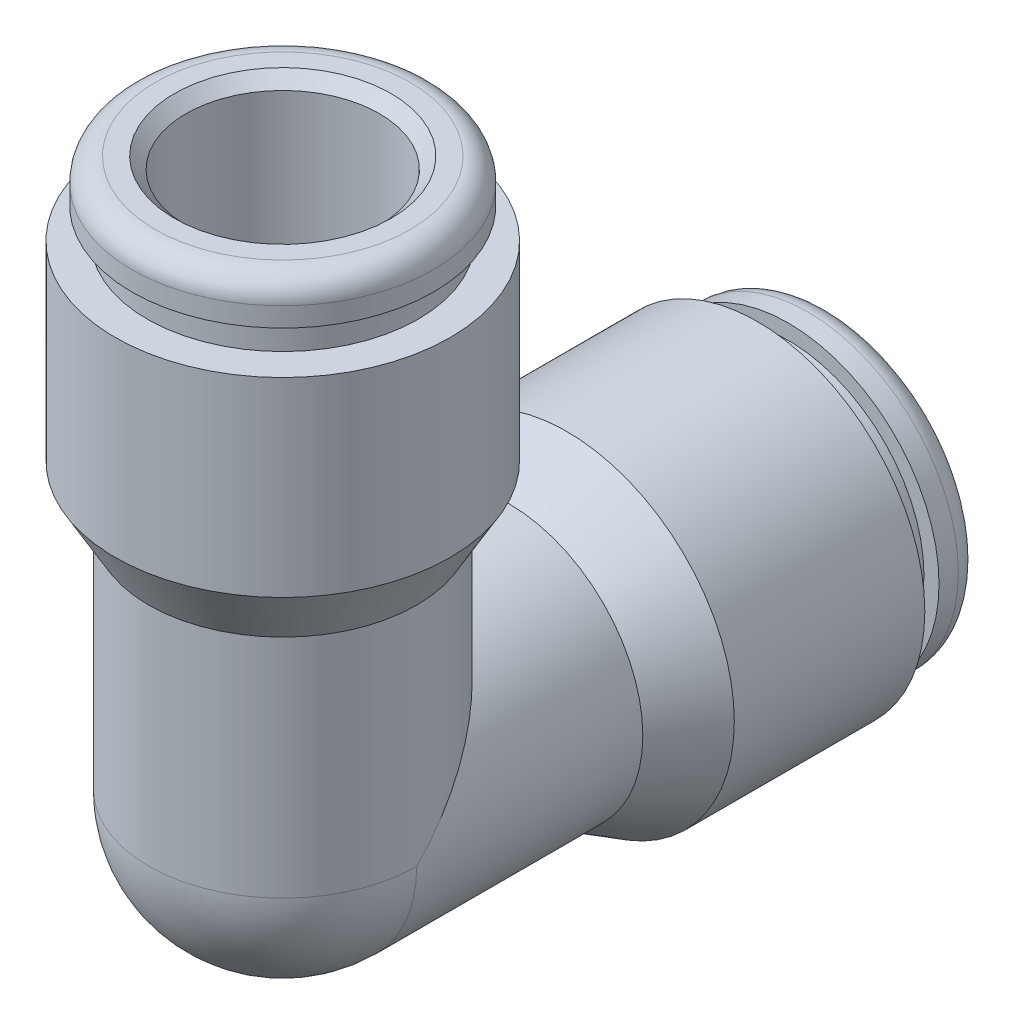
ISO-10303-21;
HEADER;
FILE_DESCRIPTION(('STEP AP214'),'2;1');
FILE_NAME('part.step','',(''),(''),'','','');
FILE_SCHEMA(('AUTOMOTIVE_DESIGN { 1 0 10303 214 1 1 1 1 }'));
ENDSEC;
DATA;
#1=APPLICATION_CONTEXT('core data for automotive mechanical design processes');
#2=APPLICATION_PROTOCOL_DEFINITION('international standard','automotive_design',2000,#1);
#3=PRODUCT_CONTEXT('',#1,'mechanical');
#4=PRODUCT('Part','Part','',(#3));
#5=PRODUCT_RELATED_PRODUCT_CATEGORY('part','',(#4));
#6=PRODUCT_DEFINITION_FORMATION('','',#4);
#7=PRODUCT_DEFINITION_CONTEXT('part definition',#1,'design');
#8=PRODUCT_DEFINITION('design','',#6,#7);
#9=PRODUCT_DEFINITION_SHAPE('','',#8);
#10=(LENGTH_UNIT() NAMED_UNIT(*) SI_UNIT(.MILLI.,.METRE.));
#11=(NAMED_UNIT(*) PLANE_ANGLE_UNIT() SI_UNIT($,.RADIAN.));
#12=(NAMED_UNIT(*) SI_UNIT($,.STERADIAN.) SOLID_ANGLE_UNIT());
#13=UNCERTAINTY_MEASURE_WITH_UNIT(LENGTH_MEASURE(1.E-05),#10,'distance_accuracy_value','');
#14=(GEOMETRIC_REPRESENTATION_CONTEXT(3) GLOBAL_UNCERTAINTY_ASSIGNED_CONTEXT((#13)) GLOBAL_UNIT_ASSIGNED_CONTEXT((#10,
#11,#12)) REPRESENTATION_CONTEXT('',''));
#15=CARTESIAN_POINT('',(0.,0.,0.));
#16=DIRECTION('',(0.,0.,1.));
#17=DIRECTION('',(1.,0.,0.));
#18=AXIS2_PLACEMENT_3D('',#15,#16,#17);
#19=CARTESIAN_POINT('',(0.,0.,0.));
#20=DIRECTION('',(0.,0.,1.));
#21=DIRECTION('',(1.,0.,0.));
#22=AXIS2_PLACEMENT_3D('',#19,#20,#21);
#23=CYLINDRICAL_SURFACE('',#22,2.413);
#24=CARTESIAN_POINT('',(0.,0.,-3.49914000000001));
#25=DIRECTION('',(0.,0.,1.));
#26=DIRECTION('',(1.,0.,0.));
#27=AXIS2_PLACEMENT_3D('',#24,#25,#26);
#28=CIRCLE('',#27,2.413);
#29=CARTESIAN_POINT('',(2.413,0.,-3.49914000000001));
#30=VERTEX_POINT('',#29);
#31=EDGE_CURVE('E11',#30,#30,#28,.T.);
#32=ORIENTED_EDGE('',*,*,#31,.F.);
#33=EDGE_LOOP('',(#32));
#34=FACE_BOUND('',#33,.T.);
#35=CARTESIAN_POINT('',(0.,0.,0.));
#36=DIRECTION('',(0.,0.707106781186546,0.707106781186549));
#37=DIRECTION('',(0.,-0.707106781186549,0.707106781186546));
#38=AXIS2_PLACEMENT_3D('',#35,#36,#37);
#39=ELLIPSE('',#38,3.41249732600627,2.413);
#40=CARTESIAN_POINT('',(-2.413,0.,0.));
#41=VERTEX_POINT('',#40);
#42=CARTESIAN_POINT('',(2.413,0.,0.));
#43=VERTEX_POINT('',#42);
#44=EDGE_CURVE('E67',#41,#43,#39,.F.);
#45=ORIENTED_EDGE('',*,*,#44,.F.);
#46=CARTESIAN_POINT('',(0.,0.,0.));
#47=DIRECTION('',(0.,0.,-1.));
#48=DIRECTION('',(1.,0.,0.));
#49=AXIS2_PLACEMENT_3D('',#46,#47,#48);
#50=CIRCLE('',#49,2.413);
#51=EDGE_CURVE('E77',#43,#41,#50,.T.);
#52=ORIENTED_EDGE('',*,*,#51,.F.);
#53=EDGE_LOOP('',(#45,#52));
#54=FACE_BOUND('',#53,.T.);
#55=ADVANCED_FACE('F40',(#34,#54),#23,.F.);
#56=CARTESIAN_POINT('',(0.,3.175,-3.49914000000001));
#57=DIRECTION('',(0.,0.,1.));
#58=DIRECTION('',(1.,0.,0.));
#59=AXIS2_PLACEMENT_3D('',#56,#57,#58);
#60=PLANE('',#59);
#61=ORIENTED_EDGE('',*,*,#31,.T.);
#62=EDGE_LOOP('',(#61));
#63=FACE_BOUND('',#62,.T.);
#64=CARTESIAN_POINT('',(0.,0.,-3.49914000000001));
#65=DIRECTION('',(0.,0.,1.));
#66=DIRECTION('',(1.,0.,0.));
#67=AXIS2_PLACEMENT_3D('',#64,#65,#66);
#68=CIRCLE('',#67,3.175);
#69=CARTESIAN_POINT('',(3.175,0.,-3.49914000000001));
#70=VERTEX_POINT('',#69);
#71=EDGE_CURVE('E79',#70,#70,#68,.T.);
#72=ORIENTED_EDGE('',*,*,#71,.F.);
#73=EDGE_LOOP('',(#72));
#74=FACE_BOUND('',#73,.T.);
#75=ADVANCED_FACE('F42',(#63,#74),#60,.F.);
#76=CARTESIAN_POINT('',(0.,0.,0.));
#77=DIRECTION('',(0.,0.,1.));
#78=DIRECTION('',(1.,0.,0.));
#79=AXIS2_PLACEMENT_3D('',#76,#77,#78);
#80=CYLINDRICAL_SURFACE('',#79,4.4);
#81=CARTESIAN_POINT('',(0.,0.,-7.425));
#82=DIRECTION('',(0.,0.,1.));
#83=DIRECTION('',(1.,0.,0.));
#84=AXIS2_PLACEMENT_3D('',#81,#82,#83);
#85=CIRCLE('',#84,4.4);
#86=CARTESIAN_POINT('',(4.4,0.,-7.425));
#87=VERTEX_POINT('',#86);
#88=EDGE_CURVE('E49',#87,#87,#85,.T.);
#89=ORIENTED_EDGE('',*,*,#88,.T.);
#90=EDGE_LOOP('',(#89));
#91=FACE_BOUND('',#90,.T.);
#92=CARTESIAN_POINT('',(0.,0.,0.));
#93=DIRECTION('',(0.,0.707106781186546,0.707106781186549));
#94=DIRECTION('',(0.,-0.707106781186549,0.707106781186546));
#95=AXIS2_PLACEMENT_3D('',#92,#93,#94);
#96=ELLIPSE('',#95,6.22253967444161,4.4);
#97=CARTESIAN_POINT('',(4.4,0.,0.));
#98=VERTEX_POINT('',#97);
#99=CARTESIAN_POINT('',(-4.4,0.,0.));
#100=VERTEX_POINT('',#99);
#101=EDGE_CURVE('E86',#98,#100,#96,.T.);
#102=ORIENTED_EDGE('',*,*,#101,.F.);
#103=CARTESIAN_POINT('',(0.,0.,0.));
#104=DIRECTION('',(0.,0.,1.));
#105=DIRECTION('',(1.,0.,0.));
#106=AXIS2_PLACEMENT_3D('',#103,#104,#105);
#107=CIRCLE('',#106,4.4);
#108=EDGE_CURVE('E56',#100,#98,#107,.T.);
#109=ORIENTED_EDGE('',*,*,#108,.F.);
#110=EDGE_LOOP('',(#102,#109));
#111=FACE_BOUND('',#110,.T.);
#112=ADVANCED_FACE('F192',(#91,#111),#80,.T.);
#113=CARTESIAN_POINT('',(0.,0.,0.));
#114=DIRECTION('',(0.,0.,1.));
#115=DIRECTION('',(1.,0.,0.));
#116=AXIS2_PLACEMENT_3D('',#113,#114,#115);
#117=CYLINDRICAL_SURFACE('',#116,3.175);
#118=CARTESIAN_POINT('',(0.,0.,-17.619));
#119=DIRECTION('',(0.,0.,1.));
#120=DIRECTION('',(1.,0.,0.));
#121=AXIS2_PLACEMENT_3D('',#118,#119,#120);
#122=CIRCLE('',#121,3.175);
#123=CARTESIAN_POINT('',(3.175,0.,-17.619));
#124=VERTEX_POINT('',#123);
#125=EDGE_CURVE('E98',#124,#124,#122,.T.);
#126=ORIENTED_EDGE('',*,*,#125,.F.);
#127=EDGE_LOOP('',(#126));
#128=FACE_BOUND('',#127,.T.);
#129=ORIENTED_EDGE('',*,*,#71,.T.);
#130=EDGE_LOOP('',(#129));
#131=FACE_BOUND('',#130,.T.);
#132=ADVANCED_FACE('F198',(#128,#131),#117,.F.);
#133=CARTESIAN_POINT('',(0.,0.,-9.33025588832576));
#134=DIRECTION('',(0.,0.,-1.));
#135=DIRECTION('',(-1.,0.,0.));
#136=AXIS2_PLACEMENT_3D('',#133,#134,#135);
#137=CONICAL_SURFACE('',#136,5.5,0.5235987755983);
#138=ORIENTED_EDGE('',*,*,#88,.F.);
#139=EDGE_LOOP('',(#138));
#140=FACE_BOUND('',#139,.T.);
#141=CARTESIAN_POINT('',(0.,0.,-9.33025588832576));
#142=DIRECTION('',(0.,0.,1.));
#143=DIRECTION('',(1.,0.,0.));
#144=AXIS2_PLACEMENT_3D('',#141,#142,#143);
#145=CIRCLE('',#144,5.5);
#146=CARTESIAN_POINT('',(5.5,0.,-9.33025588832576));
#147=VERTEX_POINT('',#146);
#148=EDGE_CURVE('E122',#147,#147,#145,.T.);
#149=ORIENTED_EDGE('',*,*,#148,.T.);
#150=EDGE_LOOP('',(#149));
#151=FACE_BOUND('',#150,.T.);
#152=ADVANCED_FACE('F200',(#140,#151),#137,.T.);
#153=CARTESIAN_POINT('',(0.,0.,0.));
#154=DIRECTION('',(0.,0.,1.));
#155=DIRECTION('',(1.,0.,0.));
#156=AXIS2_PLACEMENT_3D('',#153,#154,#155);
#157=CYLINDRICAL_SURFACE('',#156,5.5);
#158=ORIENTED_EDGE('',*,*,#148,.F.);
#159=EDGE_LOOP('',(#158));
#160=FACE_BOUND('',#159,.T.);
#161=CARTESIAN_POINT('',(0.,0.,-15.587));
#162=DIRECTION('',(0.,0.,1.));
#163=DIRECTION('',(1.,0.,0.));
#164=AXIS2_PLACEMENT_3D('',#161,#162,#163);
#165=CIRCLE('',#164,5.5);
#166=CARTESIAN_POINT('',(5.5,0.,-15.587));
#167=VERTEX_POINT('',#166);
#168=EDGE_CURVE('E119',#167,#167,#165,.T.);
#169=ORIENTED_EDGE('',*,*,#168,.T.);
#170=EDGE_LOOP('',(#169));
#171=FACE_BOUND('',#170,.T.);
#172=ADVANCED_FACE('F203',(#160,#171),#157,.T.);
#173=CARTESIAN_POINT('',(0.,5.5,-15.587));
#174=DIRECTION('',(0.,0.,1.));
#175=DIRECTION('',(1.,0.,0.));
#176=AXIS2_PLACEMENT_3D('',#173,#174,#175);
#177=PLANE('',#176);
#178=ORIENTED_EDGE('',*,*,#168,.F.);
#179=EDGE_LOOP('',(#178));
#180=FACE_BOUND('',#179,.T.);
#181=CARTESIAN_POINT('',(0.,0.,-15.587));
#182=DIRECTION('',(0.,0.,1.));
#183=DIRECTION('',(1.,0.,0.));
#184=AXIS2_PLACEMENT_3D('',#181,#182,#183);
#185=CIRCLE('',#184,4.455);
#186=CARTESIAN_POINT('',(4.455,0.,-15.587));
#187=VERTEX_POINT('',#186);
#188=EDGE_CURVE('E116',#187,#187,#185,.T.);
#189=ORIENTED_EDGE('',*,*,#188,.T.);
#190=EDGE_LOOP('',(#189));
#191=FACE_BOUND('',#190,.T.);
#192=ADVANCED_FACE('F207',(#180,#191),#177,.F.);
#193=CARTESIAN_POINT('',(0.,0.,0.));
#194=DIRECTION('',(0.,0.,1.));
#195=DIRECTION('',(1.,0.,0.));
#196=AXIS2_PLACEMENT_3D('',#193,#194,#195);
#197=CYLINDRICAL_SURFACE('',#196,4.455);
#198=ORIENTED_EDGE('',*,*,#188,.F.);
#199=EDGE_LOOP('',(#198));
#200=FACE_BOUND('',#199,.T.);
#201=CARTESIAN_POINT('',(0.,0.,-16.603));
#202=DIRECTION('',(0.,0.,1.));
#203=DIRECTION('',(1.,0.,0.));
#204=AXIS2_PLACEMENT_3D('',#201,#202,#203);
#205=CIRCLE('',#204,4.455);
#206=CARTESIAN_POINT('',(4.455,0.,-16.603));
#207=VERTEX_POINT('',#206);
#208=EDGE_CURVE('E113',#207,#207,#205,.T.);
#209=ORIENTED_EDGE('',*,*,#208,.T.);
#210=EDGE_LOOP('',(#209));
#211=FACE_BOUND('',#210,.T.);
#212=ADVANCED_FACE('F211',(#200,#211),#197,.T.);
#213=CARTESIAN_POINT('',(0.,4.95,-16.603));
#214=DIRECTION('',(0.,0.,-1.));
#215=DIRECTION('',(-1.,0.,0.));
#216=AXIS2_PLACEMENT_3D('',#213,#214,#215);
#217=PLANE('',#216);
#218=ORIENTED_EDGE('',*,*,#208,.F.);
#219=EDGE_LOOP('',(#218));
#220=FACE_BOUND('',#219,.T.);
#221=CARTESIAN_POINT('',(0.,0.,-16.603));
#222=DIRECTION('',(0.,0.,1.));
#223=DIRECTION('',(1.,0.,0.));
#224=AXIS2_PLACEMENT_3D('',#221,#222,#223);
#225=CIRCLE('',#224,4.95);
#226=CARTESIAN_POINT('',(4.95,0.,-16.603));
#227=VERTEX_POINT('',#226);
#228=EDGE_CURVE('E110',#227,#227,#225,.T.);
#229=ORIENTED_EDGE('',*,*,#228,.T.);
#230=EDGE_LOOP('',(#229));
#231=FACE_BOUND('',#230,.T.);
#232=ADVANCED_FACE('F215',(#220,#231),#217,.F.);
#233=CARTESIAN_POINT('',(0.,0.,0.));
#234=DIRECTION('',(0.,0.,1.));
#235=DIRECTION('',(1.,0.,0.));
#236=AXIS2_PLACEMENT_3D('',#233,#234,#235);
#237=CYLINDRICAL_SURFACE('',#236,4.95);
#238=ORIENTED_EDGE('',*,*,#228,.F.);
#239=EDGE_LOOP('',(#238));
#240=FACE_BOUND('',#239,.T.);
#241=CARTESIAN_POINT('',(0.,0.,-17.238));
#242=DIRECTION('',(0.,0.,1.));
#243=DIRECTION('',(1.,0.,0.));
#244=AXIS2_PLACEMENT_3D('',#241,#242,#243);
#245=CIRCLE('',#244,4.95);
#246=CARTESIAN_POINT('',(4.95,0.,-17.238));
#247=VERTEX_POINT('',#246);
#248=EDGE_CURVE('E107',#247,#247,#245,.T.);
#249=ORIENTED_EDGE('',*,*,#248,.T.);
#250=EDGE_LOOP('',(#249));
#251=FACE_BOUND('',#250,.T.);
#252=ADVANCED_FACE('F219',(#240,#251),#237,.T.);
#253=CARTESIAN_POINT('',(0.,0.,-17.238));
#254=DIRECTION('',(0.,0.,1.));
#255=DIRECTION('',(1.,0.,0.));
#256=AXIS2_PLACEMENT_3D('',#253,#254,#255);
#257=TOROIDAL_SURFACE('',#256,4.188,0.762);
#258=ORIENTED_EDGE('',*,*,#248,.F.);
#259=EDGE_LOOP('',(#258));
#260=FACE_BOUND('',#259,.T.);
#261=CARTESIAN_POINT('',(0.,0.,-18.));
#262=DIRECTION('',(0.,0.,1.));
#263=DIRECTION('',(1.,0.,0.));
#264=AXIS2_PLACEMENT_3D('',#261,#262,#263);
#265=CIRCLE('',#264,4.188);
#266=CARTESIAN_POINT('',(4.188,0.,-18.));
#267=VERTEX_POINT('',#266);
#268=EDGE_CURVE('E104',#267,#267,#265,.T.);
#269=ORIENTED_EDGE('',*,*,#268,.T.);
#270=EDGE_LOOP('',(#269));
#271=FACE_BOUND('',#270,.T.);
#272=ADVANCED_FACE('F223',(#260,#271),#257,.T.);
#273=CARTESIAN_POINT('',(0.,4.188,-18.));
#274=DIRECTION('',(0.,0.,1.));
#275=DIRECTION('',(1.,0.,0.));
#276=AXIS2_PLACEMENT_3D('',#273,#274,#275);
#277=PLANE('',#276);
#278=ORIENTED_EDGE('',*,*,#268,.F.);
#279=EDGE_LOOP('',(#278));
#280=FACE_BOUND('',#279,.T.);
#281=CARTESIAN_POINT('',(0.,0.,-18.));
#282=DIRECTION('',(0.,0.,1.));
#283=DIRECTION('',(1.,0.,0.));
#284=AXIS2_PLACEMENT_3D('',#281,#282,#283);
#285=CIRCLE('',#284,3.556);
#286=CARTESIAN_POINT('',(3.556,0.,-18.));
#287=VERTEX_POINT('',#286);
#288=EDGE_CURVE('E101',#287,#287,#285,.T.);
#289=ORIENTED_EDGE('',*,*,#288,.T.);
#290=EDGE_LOOP('',(#289));
#291=FACE_BOUND('',#290,.T.);
#292=ADVANCED_FACE('F227',(#280,#291),#277,.F.);
#293=CARTESIAN_POINT('',(0.,0.,-17.619));
#294=DIRECTION('',(0.,0.,-1.));
#295=DIRECTION('',(-1.,0.,0.));
#296=AXIS2_PLACEMENT_3D('',#293,#294,#295);
#297=CONICAL_SURFACE('',#296,3.175,0.785398163397449);
#298=ORIENTED_EDGE('',*,*,#288,.F.);
#299=EDGE_LOOP('',(#298));
#300=FACE_BOUND('',#299,.T.);
#301=ORIENTED_EDGE('',*,*,#125,.T.);
#302=EDGE_LOOP('',(#301));
#303=FACE_BOUND('',#302,.T.);
#304=ADVANCED_FACE('F231',(#300,#303),#297,.F.);
#305=CARTESIAN_POINT('',(0.,0.,0.));
#306=DIRECTION('',(1.,0.,0.));
#307=DIRECTION('',(0.,0.,-1.));
#308=AXIS2_PLACEMENT_3D('',#305,#306,#307);
#309=SPHERICAL_SURFACE('',#308,4.4);
#310=ORIENTED_EDGE('',*,*,#108,.T.);
#311=CARTESIAN_POINT('',(0.,0.,0.));
#312=DIRECTION('',(0.,-1.,0.));
#313=DIRECTION('',(1.,0.,0.));
#314=AXIS2_PLACEMENT_3D('',#311,#312,#313);
#315=CIRCLE('',#314,4.4);
#316=EDGE_CURVE('E83',#98,#100,#315,.T.);
#317=ORIENTED_EDGE('',*,*,#316,.T.);
#318=EDGE_LOOP('',(#310,#317));
#319=FACE_BOUND('',#318,.T.);
#320=ADVANCED_FACE('F235',(#319),#309,.T.);
#321=CARTESIAN_POINT('',(0.,0.,0.));
#322=DIRECTION('',(1.,0.,0.));
#323=DIRECTION('',(0.,0.,-1.));
#324=AXIS2_PLACEMENT_3D('',#321,#322,#323);
#325=SPHERICAL_SURFACE('',#324,2.413);
#326=ORIENTED_EDGE('',*,*,#51,.T.);
#327=CARTESIAN_POINT('',(0.,0.,0.));
#328=DIRECTION('',(0.,-1.,0.));
#329=DIRECTION('',(1.,0.,0.));
#330=AXIS2_PLACEMENT_3D('',#327,#328,#329);
#331=CIRCLE('',#330,2.413);
#332=EDGE_CURVE('E72',#43,#41,#331,.T.);
#333=ORIENTED_EDGE('',*,*,#332,.F.);
#334=EDGE_LOOP('',(#326,#333));
#335=FACE_BOUND('',#334,.T.);
#336=ADVANCED_FACE('F81',(#335),#325,.F.);
#337=CARTESIAN_POINT('',(0.,17.619,0.));
#338=DIRECTION('',(0.,1.,0.));
#339=DIRECTION('',(-1.,0.,0.));
#340=AXIS2_PLACEMENT_3D('',#337,#338,#339);
#341=CONICAL_SURFACE('',#340,3.175,0.785398163397449);
#342=CARTESIAN_POINT('',(0.,18.,0.));
#343=DIRECTION('',(0.,-1.,0.));
#344=DIRECTION('',(1.,0.,0.));
#345=AXIS2_PLACEMENT_3D('',#342,#343,#344);
#346=CIRCLE('',#345,3.556);
#347=CARTESIAN_POINT('',(3.556,18.,0.));
#348=VERTEX_POINT('',#347);
#349=EDGE_CURVE('E157',#348,#348,#346,.T.);
#350=ORIENTED_EDGE('',*,*,#349,.F.);
#351=EDGE_LOOP('',(#350));
#352=FACE_BOUND('',#351,.T.);
#353=CARTESIAN_POINT('',(0.,17.619,0.));
#354=DIRECTION('',(0.,-1.,0.));
#355=DIRECTION('',(1.,0.,0.));
#356=AXIS2_PLACEMENT_3D('',#353,#354,#355);
#357=CIRCLE('',#356,3.175);
#358=CARTESIAN_POINT('',(3.175,17.619,0.));
#359=VERTEX_POINT('',#358);
#360=EDGE_CURVE('E160',#359,#359,#357,.T.);
#361=ORIENTED_EDGE('',*,*,#360,.T.);
#362=EDGE_LOOP('',(#361));
#363=FACE_BOUND('',#362,.T.);
#364=ADVANCED_FACE('F242',(#352,#363),#341,.F.);
#365=CARTESIAN_POINT('',(0.,18.,4.18800000000006));
#366=DIRECTION('',(0.,-1.,0.));
#367=DIRECTION('',(1.,0.,0.));
#368=AXIS2_PLACEMENT_3D('',#365,#366,#367);
#369=PLANE('',#368);
#370=CARTESIAN_POINT('',(0.,18.,0.));
#371=DIRECTION('',(0.,-1.,0.));
#372=DIRECTION('',(1.,0.,0.));
#373=AXIS2_PLACEMENT_3D('',#370,#371,#372);
#374=CIRCLE('',#373,4.188);
#375=CARTESIAN_POINT('',(4.188,18.,0.));
#376=VERTEX_POINT('',#375);
#377=EDGE_CURVE('E154',#376,#376,#374,.T.);
#378=ORIENTED_EDGE('',*,*,#377,.F.);
#379=EDGE_LOOP('',(#378));
#380=FACE_BOUND('',#379,.T.);
#381=ORIENTED_EDGE('',*,*,#349,.T.);
#382=EDGE_LOOP('',(#381));
#383=FACE_BOUND('',#382,.T.);
#384=ADVANCED_FACE('F259',(#380,#383),#369,.F.);
#385=CARTESIAN_POINT('',(0.,17.238,0.));
#386=DIRECTION('',(0.,-1.,0.));
#387=DIRECTION('',(1.,0.,0.));
#388=AXIS2_PLACEMENT_3D('',#385,#386,#387);
#389=TOROIDAL_SURFACE('',#388,4.188,0.762);
#390=CARTESIAN_POINT('',(0.,17.238,0.));
#391=DIRECTION('',(0.,-1.,0.));
#392=DIRECTION('',(1.,0.,0.));
#393=AXIS2_PLACEMENT_3D('',#390,#391,#392);
#394=CIRCLE('',#393,4.95);
#395=CARTESIAN_POINT('',(4.95,17.238,0.));
#396=VERTEX_POINT('',#395);
#397=EDGE_CURVE('E151',#396,#396,#394,.T.);
#398=ORIENTED_EDGE('',*,*,#397,.F.);
#399=EDGE_LOOP('',(#398));
#400=FACE_BOUND('',#399,.T.);
#401=ORIENTED_EDGE('',*,*,#377,.T.);
#402=EDGE_LOOP('',(#401));
#403=FACE_BOUND('',#402,.T.);
#404=ADVANCED_FACE('F269',(#400,#403),#389,.T.);
#405=CARTESIAN_POINT('',(0.,0.,0.));
#406=DIRECTION('',(0.,-1.,0.));
#407=DIRECTION('',(1.,0.,0.));
#408=AXIS2_PLACEMENT_3D('',#405,#406,#407);
#409=CYLINDRICAL_SURFACE('',#408,4.95);
#410=CARTESIAN_POINT('',(0.,16.603,0.));
#411=DIRECTION('',(0.,-1.,0.));
#412=DIRECTION('',(1.,0.,0.));
#413=AXIS2_PLACEMENT_3D('',#410,#411,#412);
#414=CIRCLE('',#413,4.95);
#415=CARTESIAN_POINT('',(4.95,16.603,0.));
#416=VERTEX_POINT('',#415);
#417=EDGE_CURVE('E148',#416,#416,#414,.T.);
#418=ORIENTED_EDGE('',*,*,#417,.F.);
#419=EDGE_LOOP('',(#418));
#420=FACE_BOUND('',#419,.T.);
#421=ORIENTED_EDGE('',*,*,#397,.T.);
#422=EDGE_LOOP('',(#421));
#423=FACE_BOUND('',#422,.T.);
#424=ADVANCED_FACE('F277',(#420,#423),#409,.T.);
#425=CARTESIAN_POINT('',(0.,16.603,4.95000000000006));
#426=DIRECTION('',(0.,1.,0.));
#427=DIRECTION('',(-1.,0.,0.));
#428=AXIS2_PLACEMENT_3D('',#425,#426,#427);
#429=PLANE('',#428);
#430=CARTESIAN_POINT('',(0.,16.603,0.));
#431=DIRECTION('',(0.,-1.,0.));
#432=DIRECTION('',(1.,0.,0.));
#433=AXIS2_PLACEMENT_3D('',#430,#431,#432);
#434=CIRCLE('',#433,4.455);
#435=CARTESIAN_POINT('',(4.455,16.603,0.));
#436=VERTEX_POINT('',#435);
#437=EDGE_CURVE('E145',#436,#436,#434,.T.);
#438=ORIENTED_EDGE('',*,*,#437,.F.);
#439=EDGE_LOOP('',(#438));
#440=FACE_BOUND('',#439,.T.);
#441=ORIENTED_EDGE('',*,*,#417,.T.);
#442=EDGE_LOOP('',(#441));
#443=FACE_BOUND('',#442,.T.);
#444=ADVANCED_FACE('F284',(#440,#443),#429,.F.);
#445=CARTESIAN_POINT('',(0.,0.,0.));
#446=DIRECTION('',(0.,-1.,0.));
#447=DIRECTION('',(1.,0.,0.));
#448=AXIS2_PLACEMENT_3D('',#445,#446,#447);
#449=CYLINDRICAL_SURFACE('',#448,4.455);
#450=CARTESIAN_POINT('',(0.,15.587,0.));
#451=DIRECTION('',(0.,-1.,0.));
#452=DIRECTION('',(1.,0.,0.));
#453=AXIS2_PLACEMENT_3D('',#450,#451,#452);
#454=CIRCLE('',#453,4.455);
#455=CARTESIAN_POINT('',(4.455,15.587,0.));
#456=VERTEX_POINT('',#455);
#457=EDGE_CURVE('E142',#456,#456,#454,.T.);
#458=ORIENTED_EDGE('',*,*,#457,.F.);
#459=EDGE_LOOP('',(#458));
#460=FACE_BOUND('',#459,.T.);
#461=ORIENTED_EDGE('',*,*,#437,.T.);
#462=EDGE_LOOP('',(#461));
#463=FACE_BOUND('',#462,.T.);
#464=ADVANCED_FACE('F292',(#460,#463),#449,.T.);
#465=CARTESIAN_POINT('',(0.,15.587,5.50000000000005));
#466=DIRECTION('',(0.,-1.,0.));
#467=DIRECTION('',(1.,0.,0.));
#468=AXIS2_PLACEMENT_3D('',#465,#466,#467);
#469=PLANE('',#468);
#470=CARTESIAN_POINT('',(0.,15.587,0.));
#471=DIRECTION('',(0.,-1.,0.));
#472=DIRECTION('',(1.,0.,0.));
#473=AXIS2_PLACEMENT_3D('',#470,#471,#472);
#474=CIRCLE('',#473,5.5);
#475=CARTESIAN_POINT('',(5.5,15.587,0.));
#476=VERTEX_POINT('',#475);
#477=EDGE_CURVE('E139',#476,#476,#474,.T.);
#478=ORIENTED_EDGE('',*,*,#477,.F.);
#479=EDGE_LOOP('',(#478));
#480=FACE_BOUND('',#479,.T.);
#481=ORIENTED_EDGE('',*,*,#457,.T.);
#482=EDGE_LOOP('',(#481));
#483=FACE_BOUND('',#482,.T.);
#484=ADVANCED_FACE('F300',(#480,#483),#469,.F.);
#485=CARTESIAN_POINT('',(0.,0.,0.));
#486=DIRECTION('',(0.,-1.,0.));
#487=DIRECTION('',(1.,0.,0.));
#488=AXIS2_PLACEMENT_3D('',#485,#486,#487);
#489=CYLINDRICAL_SURFACE('',#488,5.5);
#490=CARTESIAN_POINT('',(0.,9.33025588832576,0.));
#491=DIRECTION('',(0.,-1.,0.));
#492=DIRECTION('',(1.,0.,0.));
#493=AXIS2_PLACEMENT_3D('',#490,#491,#492);
#494=CIRCLE('',#493,5.5);
#495=CARTESIAN_POINT('',(5.5,9.33025588832576,0.));
#496=VERTEX_POINT('',#495);
#497=EDGE_CURVE('E136',#496,#496,#494,.T.);
#498=ORIENTED_EDGE('',*,*,#497,.F.);
#499=EDGE_LOOP('',(#498));
#500=FACE_BOUND('',#499,.T.);
#501=ORIENTED_EDGE('',*,*,#477,.T.);
#502=EDGE_LOOP('',(#501));
#503=FACE_BOUND('',#502,.T.);
#504=ADVANCED_FACE('F308',(#500,#503),#489,.T.);
#505=CARTESIAN_POINT('',(0.,9.33025588832576,0.));
#506=DIRECTION('',(0.,1.,0.));
#507=DIRECTION('',(-1.,0.,0.));
#508=AXIS2_PLACEMENT_3D('',#505,#506,#507);
#509=CONICAL_SURFACE('',#508,5.5,0.5235987755983);
#510=CARTESIAN_POINT('',(0.,7.425,0.));
#511=DIRECTION('',(0.,-1.,0.));
#512=DIRECTION('',(1.,0.,0.));
#513=AXIS2_PLACEMENT_3D('',#510,#511,#512);
#514=CIRCLE('',#513,4.4);
#515=CARTESIAN_POINT('',(4.4,7.425,0.));
#516=VERTEX_POINT('',#515);
#517=EDGE_CURVE('E88',#516,#516,#514,.T.);
#518=ORIENTED_EDGE('',*,*,#517,.F.);
#519=EDGE_LOOP('',(#518));
#520=FACE_BOUND('',#519,.T.);
#521=ORIENTED_EDGE('',*,*,#497,.T.);
#522=EDGE_LOOP('',(#521));
#523=FACE_BOUND('',#522,.T.);
#524=ADVANCED_FACE('F184',(#520,#523),#509,.T.);
#525=CARTESIAN_POINT('',(0.,0.,0.));
#526=DIRECTION('',(0.,-1.,0.));
#527=DIRECTION('',(1.,0.,0.));
#528=AXIS2_PLACEMENT_3D('',#525,#526,#527);
#529=CYLINDRICAL_SURFACE('',#528,4.4);
#530=ORIENTED_EDGE('',*,*,#517,.T.);
#531=EDGE_LOOP('',(#530));
#532=FACE_BOUND('',#531,.T.);
#533=ORIENTED_EDGE('',*,*,#316,.F.);
#534=ORIENTED_EDGE('',*,*,#101,.T.);
#535=EDGE_LOOP('',(#533,#534));
#536=FACE_BOUND('',#535,.T.);
#537=ADVANCED_FACE('F176',(#532,#536),#529,.T.);
#538=CARTESIAN_POINT('',(0.,0.,0.));
#539=DIRECTION('',(0.,-1.,0.));
#540=DIRECTION('',(1.,0.,0.));
#541=AXIS2_PLACEMENT_3D('',#538,#539,#540);
#542=CYLINDRICAL_SURFACE('',#541,2.413);
#543=ORIENTED_EDGE('',*,*,#44,.T.);
#544=ORIENTED_EDGE('',*,*,#332,.T.);
#545=EDGE_LOOP('',(#543,#544));
#546=FACE_BOUND('',#545,.T.);
#547=CARTESIAN_POINT('',(0.,3.49914000000001,0.));
#548=DIRECTION('',(0.,-1.,0.));
#549=DIRECTION('',(1.,0.,0.));
#550=AXIS2_PLACEMENT_3D('',#547,#548,#549);
#551=CIRCLE('',#550,2.413);
#552=CARTESIAN_POINT('',(2.413,3.49914000000001,0.));
#553=VERTEX_POINT('',#552);
#554=EDGE_CURVE('E82',#553,#553,#551,.T.);
#555=ORIENTED_EDGE('',*,*,#554,.F.);
#556=EDGE_LOOP('',(#555));
#557=FACE_BOUND('',#556,.T.);
#558=ADVANCED_FACE('F69',(#546,#557),#542,.F.);
#559=CARTESIAN_POINT('',(0.,0.,0.));
#560=DIRECTION('',(0.,-1.,0.));
#561=DIRECTION('',(1.,0.,0.));
#562=AXIS2_PLACEMENT_3D('',#559,#560,#561);
#563=CYLINDRICAL_SURFACE('',#562,3.175);
#564=ORIENTED_EDGE('',*,*,#360,.F.);
#565=EDGE_LOOP('',(#564));
#566=FACE_BOUND('',#565,.T.);
#567=CARTESIAN_POINT('',(0.,3.49914000000001,0.));
#568=DIRECTION('',(0.,-1.,0.));
#569=DIRECTION('',(1.,0.,0.));
#570=AXIS2_PLACEMENT_3D('',#567,#568,#569);
#571=CIRCLE('',#570,3.175);
#572=CARTESIAN_POINT('',(3.175,3.49914000000001,0.));
#573=VERTEX_POINT('',#572);
#574=EDGE_CURVE('E75',#573,#573,#571,.T.);
#575=ORIENTED_EDGE('',*,*,#574,.T.);
#576=EDGE_LOOP('',(#575));
#577=FACE_BOUND('',#576,.T.);
#578=ADVANCED_FACE('F168',(#566,#577),#563,.F.);
#579=CARTESIAN_POINT('',(0.,3.49913999999999,3.17500000000001));
#580=DIRECTION('',(0.,-1.,0.));
#581=DIRECTION('',(1.,0.,0.));
#582=AXIS2_PLACEMENT_3D('',#579,#580,#581);
#583=PLANE('',#582);
#584=ORIENTED_EDGE('',*,*,#574,.F.);
#585=EDGE_LOOP('',(#584));
#586=FACE_BOUND('',#585,.T.);
#587=ORIENTED_EDGE('',*,*,#554,.T.);
#588=EDGE_LOOP('',(#587));
#589=FACE_BOUND('',#588,.T.);
#590=ADVANCED_FACE('F170',(#586,#589),#583,.F.);
#591=CLOSED_SHELL('',(#55,#75,#112,#132,#152,#172,#192,#212,#232,#252,#272,#292,#304,#320,#336,
#364,#384,#404,#424,#444,#464,#484,#504,#524,#537,#558,#578,#590));
#592=MANIFOLD_SOLID_BREP('B2',#591);
#593=ADVANCED_BREP_SHAPE_REPRESENTATION('',(#18,#592),#14);
#594=SHAPE_DEFINITION_REPRESENTATION(#9,#593);
ENDSEC;
END-ISO-10303-21;
